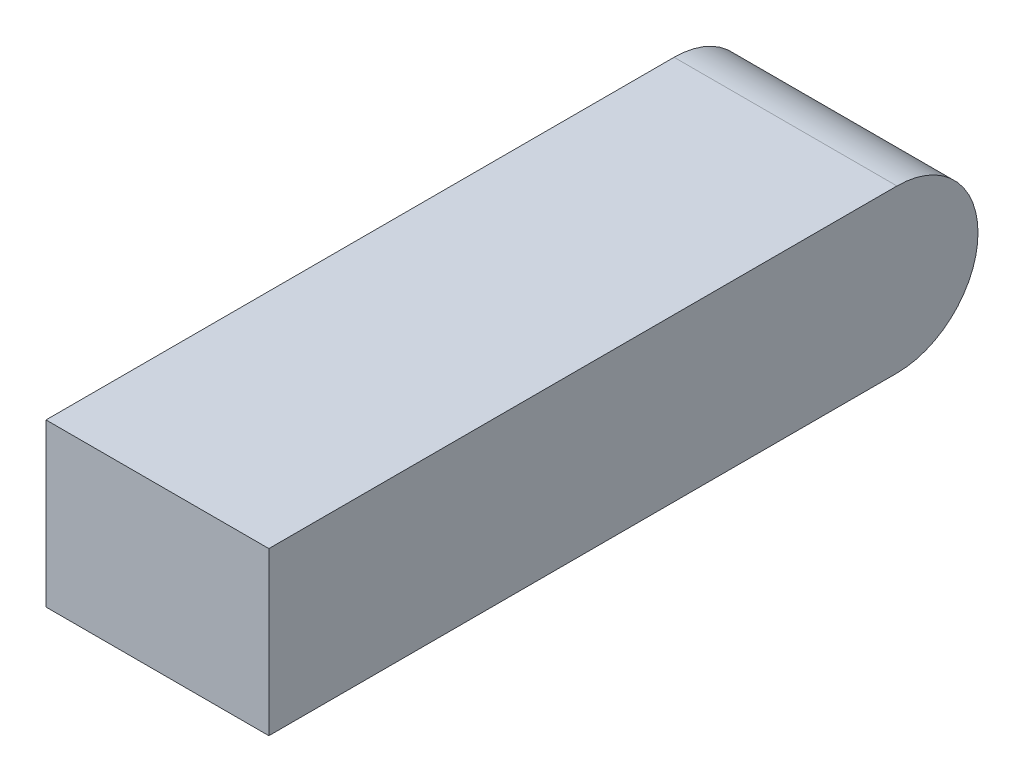
ISO-10303-21;
HEADER;
FILE_DESCRIPTION(('STEP AP214'),'2;1');
FILE_NAME('part.step','',(''),(''),'','','');
FILE_SCHEMA(('AUTOMOTIVE_DESIGN { 1 0 10303 214 1 1 1 1 }'));
ENDSEC;
DATA;
#1=APPLICATION_CONTEXT('core data for automotive mechanical design processes');
#2=APPLICATION_PROTOCOL_DEFINITION('international standard','automotive_design',2000,#1);
#3=PRODUCT_CONTEXT('',#1,'mechanical');
#4=PRODUCT('Part','Part','',(#3));
#5=PRODUCT_RELATED_PRODUCT_CATEGORY('part','',(#4));
#6=PRODUCT_DEFINITION_FORMATION('','',#4);
#7=PRODUCT_DEFINITION_CONTEXT('part definition',#1,'design');
#8=PRODUCT_DEFINITION('design','',#6,#7);
#9=PRODUCT_DEFINITION_SHAPE('','',#8);
#10=(LENGTH_UNIT() NAMED_UNIT(*) SI_UNIT(.MILLI.,.METRE.));
#11=(NAMED_UNIT(*) PLANE_ANGLE_UNIT() SI_UNIT($,.RADIAN.));
#12=(NAMED_UNIT(*) SI_UNIT($,.STERADIAN.) SOLID_ANGLE_UNIT());
#13=UNCERTAINTY_MEASURE_WITH_UNIT(LENGTH_MEASURE(1.E-05),#10,'distance_accuracy_value','');
#14=(GEOMETRIC_REPRESENTATION_CONTEXT(3) GLOBAL_UNCERTAINTY_ASSIGNED_CONTEXT((#13)) GLOBAL_UNIT_ASSIGNED_CONTEXT((#10,
#11,#12)) REPRESENTATION_CONTEXT('',''));
#15=CARTESIAN_POINT('',(0.,0.,0.));
#16=DIRECTION('',(0.,0.,1.));
#17=DIRECTION('',(1.,0.,0.));
#18=AXIS2_PLACEMENT_3D('',#15,#16,#17);
#19=CARTESIAN_POINT('',(22.,-16.,70.));
#20=DIRECTION('',(0.,0.,-1.));
#21=DIRECTION('',(-1.,0.,0.));
#22=AXIS2_PLACEMENT_3D('',#19,#20,#21);
#23=PLANE('',#22);
#24=DIRECTION('',(0.,-1.,0.));
#25=VECTOR('',#24,1.);
#26=CARTESIAN_POINT('',(-22.,-16.,70.));
#27=LINE('',#26,#25);
#28=CARTESIAN_POINT('',(-22.,16.,70.));
#29=VERTEX_POINT('',#28);
#30=CARTESIAN_POINT('',(-22.,-16.,70.));
#31=VERTEX_POINT('',#30);
#32=EDGE_CURVE('E96',#29,#31,#27,.T.);
#33=ORIENTED_EDGE('',*,*,#32,.T.);
#34=DIRECTION('',(-1.,0.,0.));
#35=VECTOR('',#34,1.);
#36=CARTESIAN_POINT('',(22.,-16.,70.));
#37=LINE('',#36,#35);
#38=CARTESIAN_POINT('',(22.,-16.,70.));
#39=VERTEX_POINT('',#38);
#40=EDGE_CURVE('E11',#39,#31,#37,.T.);
#41=ORIENTED_EDGE('',*,*,#40,.F.);
#42=DIRECTION('',(0.,-1.,0.));
#43=VECTOR('',#42,1.);
#44=CARTESIAN_POINT('',(22.,-16.,70.));
#45=LINE('',#44,#43);
#46=CARTESIAN_POINT('',(22.,16.,70.));
#47=VERTEX_POINT('',#46);
#48=EDGE_CURVE('E84',#47,#39,#45,.T.);
#49=ORIENTED_EDGE('',*,*,#48,.F.);
#50=DIRECTION('',(-1.,0.,0.));
#51=VECTOR('',#50,1.);
#52=CARTESIAN_POINT('',(22.,16.,70.));
#53=LINE('',#52,#51);
#54=EDGE_CURVE('E92',#47,#29,#53,.T.);
#55=ORIENTED_EDGE('',*,*,#54,.T.);
#56=EDGE_LOOP('',(#33,#41,#49,#55));
#57=FACE_BOUND('',#56,.T.);
#58=ADVANCED_FACE('F33',(#57),#23,.F.);
#59=CARTESIAN_POINT('',(22.,-16.,70.));
#60=DIRECTION('',(0.,1.,0.));
#61=DIRECTION('',(0.,0.,1.));
#62=AXIS2_PLACEMENT_3D('',#59,#60,#61);
#63=PLANE('',#62);
#64=DIRECTION('',(0.,0.,-1.));
#65=VECTOR('',#64,1.);
#66=CARTESIAN_POINT('',(-22.,-16.,70.));
#67=LINE('',#66,#65);
#68=CARTESIAN_POINT('',(-22.,-16.,-54.));
#69=VERTEX_POINT('',#68);
#70=EDGE_CURVE('E88',#31,#69,#67,.T.);
#71=ORIENTED_EDGE('',*,*,#70,.T.);
#72=DIRECTION('',(-1.,0.,0.));
#73=VECTOR('',#72,1.);
#74=CARTESIAN_POINT('',(22.,-16.,-54.));
#75=LINE('',#74,#73);
#76=CARTESIAN_POINT('',(22.,-16.,-54.));
#77=VERTEX_POINT('',#76);
#78=EDGE_CURVE('E41',#77,#69,#75,.T.);
#79=ORIENTED_EDGE('',*,*,#78,.F.);
#80=DIRECTION('',(0.,0.,-1.));
#81=VECTOR('',#80,1.);
#82=CARTESIAN_POINT('',(22.,-16.,70.));
#83=LINE('',#82,#81);
#84=EDGE_CURVE('E79',#39,#77,#83,.T.);
#85=ORIENTED_EDGE('',*,*,#84,.F.);
#86=ORIENTED_EDGE('',*,*,#40,.T.);
#87=EDGE_LOOP('',(#71,#79,#85,#86));
#88=FACE_BOUND('',#87,.T.);
#89=ADVANCED_FACE('F87',(#88),#63,.F.);
#90=CARTESIAN_POINT('',(22.,0.,-54.));
#91=DIRECTION('',(-1.,0.,0.));
#92=DIRECTION('',(0.,0.,1.));
#93=AXIS2_PLACEMENT_3D('',#90,#91,#92);
#94=CYLINDRICAL_SURFACE('',#93,16.);
#95=CARTESIAN_POINT('',(-22.,0.,-54.));
#96=DIRECTION('',(1.,0.,0.));
#97=DIRECTION('',(0.,0.,-1.));
#98=AXIS2_PLACEMENT_3D('',#95,#96,#97);
#99=CIRCLE('',#98,16.);
#100=CARTESIAN_POINT('',(-22.,16.,-54.));
#101=VERTEX_POINT('',#100);
#102=EDGE_CURVE('E66',#69,#101,#99,.T.);
#103=ORIENTED_EDGE('',*,*,#102,.T.);
#104=DIRECTION('',(-1.,0.,0.));
#105=VECTOR('',#104,1.);
#106=CARTESIAN_POINT('',(22.,16.,-54.));
#107=LINE('',#106,#105);
#108=CARTESIAN_POINT('',(22.,16.,-54.));
#109=VERTEX_POINT('',#108);
#110=EDGE_CURVE('E89',#109,#101,#107,.T.);
#111=ORIENTED_EDGE('',*,*,#110,.F.);
#112=CARTESIAN_POINT('',(22.,0.,-54.));
#113=DIRECTION('',(1.,0.,0.));
#114=DIRECTION('',(0.,0.,-1.));
#115=AXIS2_PLACEMENT_3D('',#112,#113,#114);
#116=CIRCLE('',#115,16.);
#117=EDGE_CURVE('E82',#77,#109,#116,.T.);
#118=ORIENTED_EDGE('',*,*,#117,.F.);
#119=ORIENTED_EDGE('',*,*,#78,.T.);
#120=EDGE_LOOP('',(#103,#111,#118,#119));
#121=FACE_BOUND('',#120,.T.);
#122=ADVANCED_FACE('F90',(#121),#94,.T.);
#123=CARTESIAN_POINT('',(22.,16.,70.));
#124=DIRECTION('',(0.,-1.,0.));
#125=DIRECTION('',(0.,0.,-1.));
#126=AXIS2_PLACEMENT_3D('',#123,#124,#125);
#127=PLANE('',#126);
#128=DIRECTION('',(0.,0.,1.));
#129=VECTOR('',#128,1.);
#130=CARTESIAN_POINT('',(-22.,16.,70.));
#131=LINE('',#130,#129);
#132=EDGE_CURVE('E72',#101,#29,#131,.T.);
#133=ORIENTED_EDGE('',*,*,#132,.T.);
#134=ORIENTED_EDGE('',*,*,#54,.F.);
#135=DIRECTION('',(0.,0.,1.));
#136=VECTOR('',#135,1.);
#137=CARTESIAN_POINT('',(22.,16.,70.));
#138=LINE('',#137,#136);
#139=EDGE_CURVE('E49',#109,#47,#138,.T.);
#140=ORIENTED_EDGE('',*,*,#139,.F.);
#141=ORIENTED_EDGE('',*,*,#110,.T.);
#142=EDGE_LOOP('',(#133,#134,#140,#141));
#143=FACE_BOUND('',#142,.T.);
#144=ADVANCED_FACE('F103',(#143),#127,.F.);
#145=CARTESIAN_POINT('',(22.,0.,-54.));
#146=DIRECTION('',(1.,0.,0.));
#147=DIRECTION('',(0.,0.,-1.));
#148=AXIS2_PLACEMENT_3D('',#145,#146,#147);
#149=PLANE('',#148);
#150=ORIENTED_EDGE('',*,*,#48,.T.);
#151=ORIENTED_EDGE('',*,*,#84,.T.);
#152=ORIENTED_EDGE('',*,*,#117,.T.);
#153=ORIENTED_EDGE('',*,*,#139,.T.);
#154=EDGE_LOOP('',(#150,#151,#152,#153));
#155=FACE_BOUND('',#154,.T.);
#156=ADVANCED_FACE('F80',(#155),#149,.T.);
#157=CARTESIAN_POINT('',(-22.,0.,-54.));
#158=DIRECTION('',(1.,0.,0.));
#159=DIRECTION('',(0.,0.,-1.));
#160=AXIS2_PLACEMENT_3D('',#157,#158,#159);
#161=PLANE('',#160);
#162=ORIENTED_EDGE('',*,*,#32,.F.);
#163=ORIENTED_EDGE('',*,*,#132,.F.);
#164=ORIENTED_EDGE('',*,*,#102,.F.);
#165=ORIENTED_EDGE('',*,*,#70,.F.);
#166=EDGE_LOOP('',(#162,#163,#164,#165));
#167=FACE_BOUND('',#166,.T.);
#168=ADVANCED_FACE('F106',(#167),#161,.F.);
#169=CLOSED_SHELL('',(#58,#89,#122,#144,#156,#168));
#170=MANIFOLD_SOLID_BREP('B2',#169);
#171=ADVANCED_BREP_SHAPE_REPRESENTATION('',(#18,#170),#14);
#172=SHAPE_DEFINITION_REPRESENTATION(#9,#171);
ENDSEC;
END-ISO-10303-21;
